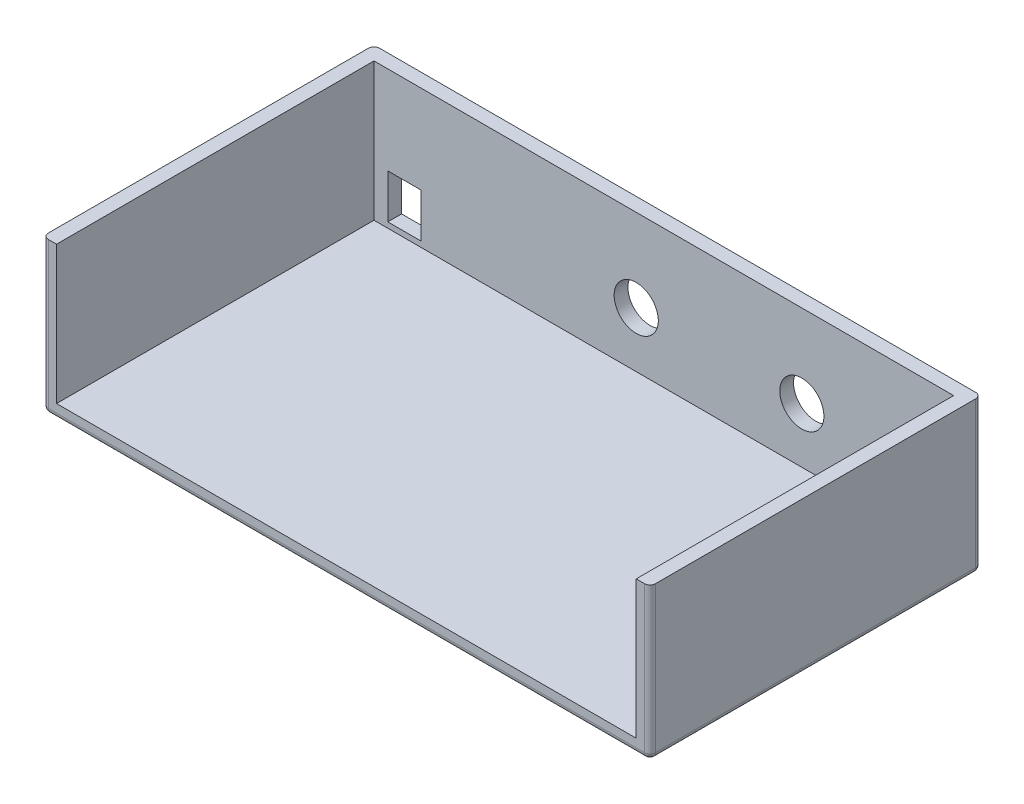
ISO-10303-21;
HEADER;
FILE_DESCRIPTION(('STEP AP214'),'2;1');
FILE_NAME('part.step','',(''),(''),'','','');
FILE_SCHEMA(('AUTOMOTIVE_DESIGN { 1 0 10303 214 1 1 1 1 }'));
ENDSEC;
DATA;
#1=APPLICATION_CONTEXT('core data for automotive mechanical design processes');
#2=APPLICATION_PROTOCOL_DEFINITION('international standard','automotive_design',2000,#1);
#3=PRODUCT_CONTEXT('',#1,'mechanical');
#4=PRODUCT('Part','Part','',(#3));
#5=PRODUCT_RELATED_PRODUCT_CATEGORY('part','',(#4));
#6=PRODUCT_DEFINITION_FORMATION('','',#4);
#7=PRODUCT_DEFINITION_CONTEXT('part definition',#1,'design');
#8=PRODUCT_DEFINITION('design','',#6,#7);
#9=PRODUCT_DEFINITION_SHAPE('','',#8);
#10=(LENGTH_UNIT() NAMED_UNIT(*) SI_UNIT(.MILLI.,.METRE.));
#11=(NAMED_UNIT(*) PLANE_ANGLE_UNIT() SI_UNIT($,.RADIAN.));
#12=(NAMED_UNIT(*) SI_UNIT($,.STERADIAN.) SOLID_ANGLE_UNIT());
#13=UNCERTAINTY_MEASURE_WITH_UNIT(LENGTH_MEASURE(1.E-05),#10,'distance_accuracy_value','');
#14=(GEOMETRIC_REPRESENTATION_CONTEXT(3) GLOBAL_UNCERTAINTY_ASSIGNED_CONTEXT((#13)) GLOBAL_UNIT_ASSIGNED_CONTEXT((#10,
#11,#12)) REPRESENTATION_CONTEXT('',''));
#15=CARTESIAN_POINT('',(0.,0.,0.));
#16=DIRECTION('',(0.,0.,1.));
#17=DIRECTION('',(1.,0.,0.));
#18=AXIS2_PLACEMENT_3D('',#15,#16,#17);
#19=CARTESIAN_POINT('',(-110.,5.,-60.));
#20=DIRECTION('',(0.,0.,-1.));
#21=DIRECTION('',(-1.,0.,0.));
#22=AXIS2_PLACEMENT_3D('',#19,#20,#21);
#23=PLANE('',#22);
#24=DIRECTION('',(0.,-1.,0.));
#25=VECTOR('',#24,1.);
#26=CARTESIAN_POINT('',(-88.,23.,-60.));
#27=LINE('',#26,#25);
#28=CARTESIAN_POINT('',(-88.,23.,-60.));
#29=VERTEX_POINT('',#28);
#30=CARTESIAN_POINT('',(-88.,7.00000000000003,-60.));
#31=VERTEX_POINT('',#30);
#32=EDGE_CURVE('E169',#29,#31,#27,.T.);
#33=ORIENTED_EDGE('',*,*,#32,.F.);
#34=DIRECTION('',(1.,0.,0.));
#35=VECTOR('',#34,1.);
#36=CARTESIAN_POINT('',(-88.,23.,-60.));
#37=LINE('',#36,#35);
#38=CARTESIAN_POINT('',(-100.,23.,-60.));
#39=VERTEX_POINT('',#38);
#40=EDGE_CURVE('E174',#39,#29,#37,.T.);
#41=ORIENTED_EDGE('',*,*,#40,.F.);
#42=DIRECTION('',(0.,1.,0.));
#43=VECTOR('',#42,1.);
#44=CARTESIAN_POINT('',(-100.,23.,-60.));
#45=LINE('',#44,#43);
#46=CARTESIAN_POINT('',(-100.,7.00000000000002,-60.));
#47=VERTEX_POINT('',#46);
#48=EDGE_CURVE('E197',#47,#39,#45,.T.);
#49=ORIENTED_EDGE('',*,*,#48,.F.);
#50=DIRECTION('',(-1.,0.,0.));
#51=VECTOR('',#50,1.);
#52=CARTESIAN_POINT('',(-88.,7.00000000000003,-60.));
#53=LINE('',#52,#51);
#54=EDGE_CURVE('E190',#31,#47,#53,.T.);
#55=ORIENTED_EDGE('',*,*,#54,.F.);
#56=EDGE_LOOP('',(#33,#41,#49,#55));
#57=FACE_BOUND('',#56,.T.);
#58=CARTESIAN_POINT('',(50.,25.,-60.));
#59=DIRECTION('',(0.,0.,-1.));
#60=DIRECTION('',(-1.,0.,0.));
#61=AXIS2_PLACEMENT_3D('',#58,#59,#60);
#62=CIRCLE('',#61,8.);
#63=CARTESIAN_POINT('',(42.,25.,-60.));
#64=VERTEX_POINT('',#63);
#65=EDGE_CURVE('E206',#64,#64,#62,.T.);
#66=ORIENTED_EDGE('',*,*,#65,.F.);
#67=EDGE_LOOP('',(#66));
#68=FACE_BOUND('',#67,.T.);
#69=CARTESIAN_POINT('',(-10.,25.,-60.));
#70=DIRECTION('',(0.,0.,-1.));
#71=DIRECTION('',(-1.,0.,0.));
#72=AXIS2_PLACEMENT_3D('',#69,#70,#71);
#73=CIRCLE('',#72,8.);
#74=CARTESIAN_POINT('',(-18.,25.,-60.));
#75=VERTEX_POINT('',#74);
#76=EDGE_CURVE('E213',#75,#75,#73,.T.);
#77=ORIENTED_EDGE('',*,*,#76,.F.);
#78=EDGE_LOOP('',(#77));
#79=FACE_BOUND('',#78,.T.);
#80=CARTESIAN_POINT('',(90.,25.,-60.));
#81=DIRECTION('',(0.,0.,-1.));
#82=DIRECTION('',(-1.,0.,0.));
#83=AXIS2_PLACEMENT_3D('',#80,#81,#82);
#84=CIRCLE('',#83,3.50000000000001);
#85=CARTESIAN_POINT('',(86.5,25.,-60.));
#86=VERTEX_POINT('',#85);
#87=EDGE_CURVE('E219',#86,#86,#84,.T.);
#88=ORIENTED_EDGE('',*,*,#87,.F.);
#89=EDGE_LOOP('',(#88));
#90=FACE_BOUND('',#89,.T.);
#91=DIRECTION('',(1.,0.,0.));
#92=VECTOR('',#91,1.);
#93=CARTESIAN_POINT('',(-110.,2.,-60.));
#94=LINE('',#93,#92);
#95=CARTESIAN_POINT('',(108.,2.,-60.));
#96=VERTEX_POINT('',#95);
#97=CARTESIAN_POINT('',(-108.,2.,-60.));
#98=VERTEX_POINT('',#97);
#99=EDGE_CURVE('E290',#96,#98,#94,.F.);
#100=ORIENTED_EDGE('',*,*,#99,.T.);
#101=DIRECTION('',(0.,-1.,0.));
#102=VECTOR('',#101,1.);
#103=CARTESIAN_POINT('',(-108.,5.,-60.));
#104=LINE('',#103,#102);
#105=CARTESIAN_POINT('',(-108.,55.,-60.));
#106=VERTEX_POINT('',#105);
#107=EDGE_CURVE('E292',#98,#106,#104,.F.);
#108=ORIENTED_EDGE('',*,*,#107,.T.);
#109=DIRECTION('',(-1.,0.,0.));
#110=VECTOR('',#109,1.);
#111=CARTESIAN_POINT('',(110.,55.,-60.));
#112=LINE('',#111,#110);
#113=CARTESIAN_POINT('',(108.,55.,-60.));
#114=VERTEX_POINT('',#113);
#115=EDGE_CURVE('E242',#114,#106,#112,.T.);
#116=ORIENTED_EDGE('',*,*,#115,.F.);
#117=DIRECTION('',(0.,-1.,0.));
#118=VECTOR('',#117,1.);
#119=CARTESIAN_POINT('',(108.,0.,-60.));
#120=LINE('',#119,#118);
#121=EDGE_CURVE('E288',#114,#96,#120,.T.);
#122=ORIENTED_EDGE('',*,*,#121,.T.);
#123=EDGE_LOOP('',(#100,#108,#116,#122));
#124=FACE_BOUND('',#123,.T.);
#125=ADVANCED_FACE('F36',(#57,#68,#79,#90,#124),#23,.T.);
#126=CARTESIAN_POINT('',(-110.,5.,60.));
#127=DIRECTION('',(-1.,0.,0.));
#128=DIRECTION('',(0.,0.,1.));
#129=AXIS2_PLACEMENT_3D('',#126,#127,#128);
#130=PLANE('',#129);
#131=DIRECTION('',(0.,0.,1.));
#132=VECTOR('',#131,1.);
#133=CARTESIAN_POINT('',(-110.,55.,-60.));
#134=LINE('',#133,#132);
#135=CARTESIAN_POINT('',(-110.,55.,-58.));
#136=VERTEX_POINT('',#135);
#137=CARTESIAN_POINT('',(-110.,55.,58.));
#138=VERTEX_POINT('',#137);
#139=EDGE_CURVE('E224',#136,#138,#134,.T.);
#140=ORIENTED_EDGE('',*,*,#139,.F.);
#141=DIRECTION('',(0.,-1.,0.));
#142=VECTOR('',#141,1.);
#143=CARTESIAN_POINT('',(-110.,5.,-58.));
#144=LINE('',#143,#142);
#145=CARTESIAN_POINT('',(-110.,2.,-58.));
#146=VERTEX_POINT('',#145);
#147=EDGE_CURVE('E53',#136,#146,#144,.T.);
#148=ORIENTED_EDGE('',*,*,#147,.T.);
#149=DIRECTION('',(0.,0.,-1.));
#150=VECTOR('',#149,1.);
#151=CARTESIAN_POINT('',(-110.,2.,60.));
#152=LINE('',#151,#150);
#153=CARTESIAN_POINT('',(-110.,2.,58.));
#154=VERTEX_POINT('',#153);
#155=EDGE_CURVE('E58',#146,#154,#152,.F.);
#156=ORIENTED_EDGE('',*,*,#155,.T.);
#157=DIRECTION('',(0.,-1.,0.));
#158=VECTOR('',#157,1.);
#159=CARTESIAN_POINT('',(-110.,55.,58.));
#160=LINE('',#159,#158);
#161=EDGE_CURVE('E294',#154,#138,#160,.F.);
#162=ORIENTED_EDGE('',*,*,#161,.T.);
#163=EDGE_LOOP('',(#140,#148,#156,#162));
#164=FACE_BOUND('',#163,.T.);
#165=ADVANCED_FACE('F353',(#164),#130,.T.);
#166=CARTESIAN_POINT('',(-110.,5.,60.));
#167=DIRECTION('',(0.,0.,-1.));
#168=DIRECTION('',(-1.,0.,0.));
#169=AXIS2_PLACEMENT_3D('',#166,#167,#168);
#170=PLANE('',#169);
#171=DIRECTION('',(1.,0.,0.));
#172=VECTOR('',#171,1.);
#173=CARTESIAN_POINT('',(-110.,55.,60.));
#174=LINE('',#173,#172);
#175=CARTESIAN_POINT('',(-108.,55.,60.));
#176=VERTEX_POINT('',#175);
#177=CARTESIAN_POINT('',(-105.,55.,60.));
#178=VERTEX_POINT('',#177);
#179=EDGE_CURVE('E227',#176,#178,#174,.T.);
#180=ORIENTED_EDGE('',*,*,#179,.F.);
#181=DIRECTION('',(0.,-1.,0.));
#182=VECTOR('',#181,1.);
#183=CARTESIAN_POINT('',(-108.,0.,60.));
#184=LINE('',#183,#182);
#185=CARTESIAN_POINT('',(-108.,2.,60.));
#186=VERTEX_POINT('',#185);
#187=EDGE_CURVE('E271',#176,#186,#184,.T.);
#188=ORIENTED_EDGE('',*,*,#187,.T.);
#189=DIRECTION('',(1.,0.,0.));
#190=VECTOR('',#189,1.);
#191=CARTESIAN_POINT('',(-110.,2.,60.));
#192=LINE('',#191,#190);
#193=CARTESIAN_POINT('',(108.,2.,60.));
#194=VERTEX_POINT('',#193);
#195=EDGE_CURVE('E268',#186,#194,#192,.T.);
#196=ORIENTED_EDGE('',*,*,#195,.T.);
#197=DIRECTION('',(0.,-1.,0.));
#198=VECTOR('',#197,1.);
#199=CARTESIAN_POINT('',(108.,5.,60.));
#200=LINE('',#199,#198);
#201=CARTESIAN_POINT('',(108.,55.,60.));
#202=VERTEX_POINT('',#201);
#203=EDGE_CURVE('E266',#194,#202,#200,.F.);
#204=ORIENTED_EDGE('',*,*,#203,.T.);
#205=DIRECTION('',(1.,0.,0.));
#206=VECTOR('',#205,1.);
#207=CARTESIAN_POINT('',(110.,55.,60.));
#208=LINE('',#207,#206);
#209=CARTESIAN_POINT('',(105.,55.,60.));
#210=VERTEX_POINT('',#209);
#211=EDGE_CURVE('E236',#210,#202,#208,.T.);
#212=ORIENTED_EDGE('',*,*,#211,.F.);
#213=DIRECTION('',(0.,-1.,0.));
#214=VECTOR('',#213,1.);
#215=CARTESIAN_POINT('',(105.,55.,60.));
#216=LINE('',#215,#214);
#217=CARTESIAN_POINT('',(105.,5.,60.));
#218=VERTEX_POINT('',#217);
#219=EDGE_CURVE('E245',#210,#218,#216,.T.);
#220=ORIENTED_EDGE('',*,*,#219,.T.);
#221=DIRECTION('',(1.,0.,0.));
#222=VECTOR('',#221,1.);
#223=CARTESIAN_POINT('',(-110.,5.,60.));
#224=LINE('',#223,#222);
#225=CARTESIAN_POINT('',(-105.,5.,60.));
#226=VERTEX_POINT('',#225);
#227=EDGE_CURVE('E264',#226,#218,#224,.T.);
#228=ORIENTED_EDGE('',*,*,#227,.F.);
#229=DIRECTION('',(0.,-1.,0.));
#230=VECTOR('',#229,1.);
#231=CARTESIAN_POINT('',(-105.,55.,60.));
#232=LINE('',#231,#230);
#233=EDGE_CURVE('E261',#178,#226,#232,.T.);
#234=ORIENTED_EDGE('',*,*,#233,.F.);
#235=EDGE_LOOP('',(#180,#188,#196,#204,#212,#220,#228,#234));
#236=FACE_BOUND('',#235,.T.);
#237=ADVANCED_FACE('F394',(#236),#170,.F.);
#238=CARTESIAN_POINT('',(110.,5.,60.));
#239=DIRECTION('',(-1.,0.,0.));
#240=DIRECTION('',(0.,0.,1.));
#241=AXIS2_PLACEMENT_3D('',#238,#239,#240);
#242=PLANE('',#241);
#243=DIRECTION('',(0.,0.,-1.));
#244=VECTOR('',#243,1.);
#245=CARTESIAN_POINT('',(110.,2.,60.));
#246=LINE('',#245,#244);
#247=CARTESIAN_POINT('',(110.,2.,58.));
#248=VERTEX_POINT('',#247);
#249=CARTESIAN_POINT('',(110.,2.,-58.));
#250=VERTEX_POINT('',#249);
#251=EDGE_CURVE('E284',#248,#250,#246,.T.);
#252=ORIENTED_EDGE('',*,*,#251,.T.);
#253=DIRECTION('',(0.,-1.,0.));
#254=VECTOR('',#253,1.);
#255=CARTESIAN_POINT('',(110.,55.,-58.));
#256=LINE('',#255,#254);
#257=CARTESIAN_POINT('',(110.,55.,-58.));
#258=VERTEX_POINT('',#257);
#259=EDGE_CURVE('E286',#250,#258,#256,.F.);
#260=ORIENTED_EDGE('',*,*,#259,.T.);
#261=DIRECTION('',(0.,0.,-1.));
#262=VECTOR('',#261,1.);
#263=CARTESIAN_POINT('',(110.,55.,-60.));
#264=LINE('',#263,#262);
#265=CARTESIAN_POINT('',(110.,55.,58.));
#266=VERTEX_POINT('',#265);
#267=EDGE_CURVE('E239',#266,#258,#264,.T.);
#268=ORIENTED_EDGE('',*,*,#267,.F.);
#269=DIRECTION('',(0.,-1.,0.));
#270=VECTOR('',#269,1.);
#271=CARTESIAN_POINT('',(110.,5.,58.));
#272=LINE('',#271,#270);
#273=EDGE_CURVE('E282',#266,#248,#272,.T.);
#274=ORIENTED_EDGE('',*,*,#273,.T.);
#275=EDGE_LOOP('',(#252,#260,#268,#274));
#276=FACE_BOUND('',#275,.T.);
#277=ADVANCED_FACE('F412',(#276),#242,.F.);
#278=CARTESIAN_POINT('',(0.,5.,0.));
#279=DIRECTION('',(0.,1.,0.));
#280=DIRECTION('',(0.,0.,1.));
#281=AXIS2_PLACEMENT_3D('',#278,#279,#280);
#282=PLANE('',#281);
#283=DIRECTION('',(0.,0.,1.));
#284=VECTOR('',#283,1.);
#285=CARTESIAN_POINT('',(105.,5.,-55.));
#286=LINE('',#285,#284);
#287=CARTESIAN_POINT('',(105.,5.,-55.));
#288=VERTEX_POINT('',#287);
#289=EDGE_CURVE('E228',#288,#218,#286,.T.);
#290=ORIENTED_EDGE('',*,*,#289,.F.);
#291=DIRECTION('',(1.,0.,0.));
#292=VECTOR('',#291,1.);
#293=CARTESIAN_POINT('',(105.,5.,-55.));
#294=LINE('',#293,#292);
#295=CARTESIAN_POINT('',(-105.,5.,-55.));
#296=VERTEX_POINT('',#295);
#297=EDGE_CURVE('E248',#296,#288,#294,.T.);
#298=ORIENTED_EDGE('',*,*,#297,.F.);
#299=DIRECTION('',(0.,0.,-1.));
#300=VECTOR('',#299,1.);
#301=CARTESIAN_POINT('',(-105.,5.,-55.));
#302=LINE('',#301,#300);
#303=EDGE_CURVE('E182',#226,#296,#302,.T.);
#304=ORIENTED_EDGE('',*,*,#303,.F.);
#305=ORIENTED_EDGE('',*,*,#227,.T.);
#306=EDGE_LOOP('',(#290,#298,#304,#305));
#307=FACE_BOUND('',#306,.T.);
#308=ADVANCED_FACE('F410',(#307),#282,.T.);
#309=CARTESIAN_POINT('',(0.,0.,0.));
#310=DIRECTION('',(0.,1.,0.));
#311=DIRECTION('',(0.,0.,1.));
#312=AXIS2_PLACEMENT_3D('',#309,#310,#311);
#313=PLANE('',#312);
#314=DIRECTION('',(0.,0.,-1.));
#315=VECTOR('',#314,1.);
#316=CARTESIAN_POINT('',(108.,0.,0.));
#317=LINE('',#316,#315);
#318=CARTESIAN_POINT('',(108.,0.,-58.));
#319=VERTEX_POINT('',#318);
#320=CARTESIAN_POINT('',(108.,0.,58.));
#321=VERTEX_POINT('',#320);
#322=EDGE_CURVE('E277',#319,#321,#317,.F.);
#323=ORIENTED_EDGE('',*,*,#322,.T.);
#324=DIRECTION('',(1.,0.,0.));
#325=VECTOR('',#324,1.);
#326=CARTESIAN_POINT('',(0.,0.,58.));
#327=LINE('',#326,#325);
#328=CARTESIAN_POINT('',(-108.,0.,58.));
#329=VERTEX_POINT('',#328);
#330=EDGE_CURVE('E279',#321,#329,#327,.F.);
#331=ORIENTED_EDGE('',*,*,#330,.T.);
#332=DIRECTION('',(0.,0.,-1.));
#333=VECTOR('',#332,1.);
#334=CARTESIAN_POINT('',(-108.,0.,-60.));
#335=LINE('',#334,#333);
#336=CARTESIAN_POINT('',(-108.,0.,-58.));
#337=VERTEX_POINT('',#336);
#338=EDGE_CURVE('E273',#329,#337,#335,.T.);
#339=ORIENTED_EDGE('',*,*,#338,.T.);
#340=DIRECTION('',(1.,0.,0.));
#341=VECTOR('',#340,1.);
#342=CARTESIAN_POINT('',(110.,0.,-58.));
#343=LINE('',#342,#341);
#344=EDGE_CURVE('E275',#337,#319,#343,.T.);
#345=ORIENTED_EDGE('',*,*,#344,.T.);
#346=EDGE_LOOP('',(#323,#331,#339,#345));
#347=FACE_BOUND('',#346,.T.);
#348=ADVANCED_FACE('F380',(#347),#313,.F.);
#349=CARTESIAN_POINT('',(-105.,55.,-55.));
#350=DIRECTION('',(-1.,0.,0.));
#351=DIRECTION('',(0.,0.,1.));
#352=AXIS2_PLACEMENT_3D('',#349,#350,#351);
#353=PLANE('',#352);
#354=ORIENTED_EDGE('',*,*,#303,.T.);
#355=DIRECTION('',(0.,-1.,0.));
#356=VECTOR('',#355,1.);
#357=CARTESIAN_POINT('',(-105.,55.,-55.));
#358=LINE('',#357,#356);
#359=CARTESIAN_POINT('',(-105.,55.,-55.));
#360=VERTEX_POINT('',#359);
#361=EDGE_CURVE('E258',#360,#296,#358,.T.);
#362=ORIENTED_EDGE('',*,*,#361,.F.);
#363=DIRECTION('',(0.,0.,-1.));
#364=VECTOR('',#363,1.);
#365=CARTESIAN_POINT('',(-105.,55.,-55.));
#366=LINE('',#365,#364);
#367=EDGE_CURVE('E230',#178,#360,#366,.T.);
#368=ORIENTED_EDGE('',*,*,#367,.F.);
#369=ORIENTED_EDGE('',*,*,#233,.T.);
#370=EDGE_LOOP('',(#354,#362,#368,#369));
#371=FACE_BOUND('',#370,.T.);
#372=ADVANCED_FACE('F402',(#371),#353,.F.);
#373=CARTESIAN_POINT('',(105.,55.,-55.));
#374=DIRECTION('',(0.,0.,-1.));
#375=DIRECTION('',(-1.,0.,0.));
#376=AXIS2_PLACEMENT_3D('',#373,#374,#375);
#377=PLANE('',#376);
#378=DIRECTION('',(-1.,0.,0.));
#379=VECTOR('',#378,1.);
#380=CARTESIAN_POINT('',(-88.,23.,-55.));
#381=LINE('',#380,#379);
#382=CARTESIAN_POINT('',(-88.,23.,-55.));
#383=VERTEX_POINT('',#382);
#384=CARTESIAN_POINT('',(-100.,23.,-55.));
#385=VERTEX_POINT('',#384);
#386=EDGE_CURVE('E188',#383,#385,#381,.T.);
#387=ORIENTED_EDGE('',*,*,#386,.F.);
#388=DIRECTION('',(0.,1.,0.));
#389=VECTOR('',#388,1.);
#390=CARTESIAN_POINT('',(-88.,23.,-55.));
#391=LINE('',#390,#389);
#392=CARTESIAN_POINT('',(-88.,7.00000000000003,-55.));
#393=VERTEX_POINT('',#392);
#394=EDGE_CURVE('E166',#393,#383,#391,.T.);
#395=ORIENTED_EDGE('',*,*,#394,.F.);
#396=DIRECTION('',(1.,0.,0.));
#397=VECTOR('',#396,1.);
#398=CARTESIAN_POINT('',(-88.,7.00000000000003,-55.));
#399=LINE('',#398,#397);
#400=CARTESIAN_POINT('',(-100.,7.00000000000002,-55.));
#401=VERTEX_POINT('',#400);
#402=EDGE_CURVE('E178',#401,#393,#399,.T.);
#403=ORIENTED_EDGE('',*,*,#402,.F.);
#404=DIRECTION('',(0.,-1.,0.));
#405=VECTOR('',#404,1.);
#406=CARTESIAN_POINT('',(-100.,23.,-55.));
#407=LINE('',#406,#405);
#408=EDGE_CURVE('E192',#385,#401,#407,.T.);
#409=ORIENTED_EDGE('',*,*,#408,.F.);
#410=EDGE_LOOP('',(#387,#395,#403,#409));
#411=FACE_BOUND('',#410,.T.);
#412=CARTESIAN_POINT('',(50.,25.,-55.));
#413=DIRECTION('',(0.,0.,-1.));
#414=DIRECTION('',(-1.,0.,0.));
#415=AXIS2_PLACEMENT_3D('',#412,#413,#414);
#416=CIRCLE('',#415,8.);
#417=CARTESIAN_POINT('',(42.,25.,-55.));
#418=VERTEX_POINT('',#417);
#419=EDGE_CURVE('E209',#418,#418,#416,.F.);
#420=ORIENTED_EDGE('',*,*,#419,.F.);
#421=EDGE_LOOP('',(#420));
#422=FACE_BOUND('',#421,.T.);
#423=CARTESIAN_POINT('',(-10.,25.,-55.));
#424=DIRECTION('',(0.,0.,-1.));
#425=DIRECTION('',(-1.,0.,0.));
#426=AXIS2_PLACEMENT_3D('',#423,#424,#425);
#427=CIRCLE('',#426,8.);
#428=CARTESIAN_POINT('',(-18.,25.,-55.));
#429=VERTEX_POINT('',#428);
#430=EDGE_CURVE('E210',#429,#429,#427,.F.);
#431=ORIENTED_EDGE('',*,*,#430,.F.);
#432=EDGE_LOOP('',(#431));
#433=FACE_BOUND('',#432,.T.);
#434=CARTESIAN_POINT('',(90.,25.,-55.));
#435=DIRECTION('',(0.,0.,-1.));
#436=DIRECTION('',(-1.,0.,0.));
#437=AXIS2_PLACEMENT_3D('',#434,#435,#436);
#438=CIRCLE('',#437,3.50000000000001);
#439=CARTESIAN_POINT('',(86.5,25.,-55.));
#440=VERTEX_POINT('',#439);
#441=EDGE_CURVE('E216',#440,#440,#438,.F.);
#442=ORIENTED_EDGE('',*,*,#441,.F.);
#443=EDGE_LOOP('',(#442));
#444=FACE_BOUND('',#443,.T.);
#445=ORIENTED_EDGE('',*,*,#297,.T.);
#446=DIRECTION('',(0.,-1.,0.));
#447=VECTOR('',#446,1.);
#448=CARTESIAN_POINT('',(105.,55.,-55.));
#449=LINE('',#448,#447);
#450=CARTESIAN_POINT('',(105.,55.,-55.));
#451=VERTEX_POINT('',#450);
#452=EDGE_CURVE('E255',#451,#288,#449,.T.);
#453=ORIENTED_EDGE('',*,*,#452,.F.);
#454=DIRECTION('',(1.,0.,0.));
#455=VECTOR('',#454,1.);
#456=CARTESIAN_POINT('',(105.,55.,-55.));
#457=LINE('',#456,#455);
#458=EDGE_CURVE('E232',#360,#451,#457,.T.);
#459=ORIENTED_EDGE('',*,*,#458,.F.);
#460=ORIENTED_EDGE('',*,*,#361,.T.);
#461=EDGE_LOOP('',(#445,#453,#459,#460));
#462=FACE_BOUND('',#461,.T.);
#463=ADVANCED_FACE('F185',(#411,#422,#433,#444,#462),#377,.F.);
#464=CARTESIAN_POINT('',(105.,55.,-55.));
#465=DIRECTION('',(1.,0.,0.));
#466=DIRECTION('',(0.,0.,-1.));
#467=AXIS2_PLACEMENT_3D('',#464,#465,#466);
#468=PLANE('',#467);
#469=ORIENTED_EDGE('',*,*,#289,.T.);
#470=ORIENTED_EDGE('',*,*,#219,.F.);
#471=DIRECTION('',(0.,0.,1.));
#472=VECTOR('',#471,1.);
#473=CARTESIAN_POINT('',(105.,55.,-55.));
#474=LINE('',#473,#472);
#475=EDGE_CURVE('E234',#451,#210,#474,.T.);
#476=ORIENTED_EDGE('',*,*,#475,.F.);
#477=ORIENTED_EDGE('',*,*,#452,.T.);
#478=EDGE_LOOP('',(#469,#470,#476,#477));
#479=FACE_BOUND('',#478,.T.);
#480=ADVANCED_FACE('F407',(#479),#468,.F.);
#481=CARTESIAN_POINT('',(0.,55.,0.));
#482=DIRECTION('',(0.,1.,0.));
#483=DIRECTION('',(0.,0.,1.));
#484=AXIS2_PLACEMENT_3D('',#481,#482,#483);
#485=PLANE('',#484);
#486=ORIENTED_EDGE('',*,*,#115,.T.);
#487=CARTESIAN_POINT('',(-108.,55.,-58.));
#488=DIRECTION('',(0.,1.,0.));
#489=DIRECTION('',(0.,0.,1.));
#490=AXIS2_PLACEMENT_3D('',#487,#488,#489);
#491=CIRCLE('',#490,2.);
#492=EDGE_CURVE('E11',#106,#136,#491,.T.);
#493=ORIENTED_EDGE('',*,*,#492,.T.);
#494=ORIENTED_EDGE('',*,*,#139,.T.);
#495=CARTESIAN_POINT('',(-108.,55.,58.));
#496=DIRECTION('',(0.,1.,0.));
#497=DIRECTION('',(0.,0.,1.));
#498=AXIS2_PLACEMENT_3D('',#495,#496,#497);
#499=CIRCLE('',#498,2.);
#500=EDGE_CURVE('E45',#138,#176,#499,.T.);
#501=ORIENTED_EDGE('',*,*,#500,.T.);
#502=ORIENTED_EDGE('',*,*,#179,.T.);
#503=ORIENTED_EDGE('',*,*,#367,.T.);
#504=ORIENTED_EDGE('',*,*,#458,.T.);
#505=ORIENTED_EDGE('',*,*,#475,.T.);
#506=ORIENTED_EDGE('',*,*,#211,.T.);
#507=CARTESIAN_POINT('',(108.,55.,58.));
#508=DIRECTION('',(0.,1.,0.));
#509=DIRECTION('',(0.,0.,1.));
#510=AXIS2_PLACEMENT_3D('',#507,#508,#509);
#511=CIRCLE('',#510,2.);
#512=EDGE_CURVE('E298',#202,#266,#511,.T.);
#513=ORIENTED_EDGE('',*,*,#512,.T.);
#514=ORIENTED_EDGE('',*,*,#267,.T.);
#515=CARTESIAN_POINT('',(108.,55.,-58.));
#516=DIRECTION('',(0.,1.,0.));
#517=DIRECTION('',(0.,0.,1.));
#518=AXIS2_PLACEMENT_3D('',#515,#516,#517);
#519=CIRCLE('',#518,2.);
#520=EDGE_CURVE('E300',#258,#114,#519,.T.);
#521=ORIENTED_EDGE('',*,*,#520,.T.);
#522=EDGE_LOOP('',(#486,#493,#494,#501,#502,#503,#504,#505,#506,#513,#514,#521));
#523=FACE_BOUND('',#522,.T.);
#524=ADVANCED_FACE('F355',(#523),#485,.T.);
#525=CARTESIAN_POINT('',(90.,25.,60.001));
#526=DIRECTION('',(0.,0.,-1.));
#527=DIRECTION('',(-1.,0.,0.));
#528=AXIS2_PLACEMENT_3D('',#525,#526,#527);
#529=CYLINDRICAL_SURFACE('',#528,3.50000000000001);
#530=ORIENTED_EDGE('',*,*,#87,.T.);
#531=EDGE_LOOP('',(#530));
#532=FACE_BOUND('',#531,.T.);
#533=ORIENTED_EDGE('',*,*,#441,.T.);
#534=EDGE_LOOP('',(#533));
#535=FACE_BOUND('',#534,.T.);
#536=ADVANCED_FACE('F477',(#532,#535),#529,.F.);
#537=CARTESIAN_POINT('',(-10.,25.,60.001));
#538=DIRECTION('',(0.,0.,-1.));
#539=DIRECTION('',(-1.,0.,0.));
#540=AXIS2_PLACEMENT_3D('',#537,#538,#539);
#541=CYLINDRICAL_SURFACE('',#540,8.);
#542=ORIENTED_EDGE('',*,*,#76,.T.);
#543=EDGE_LOOP('',(#542));
#544=FACE_BOUND('',#543,.T.);
#545=ORIENTED_EDGE('',*,*,#430,.T.);
#546=EDGE_LOOP('',(#545));
#547=FACE_BOUND('',#546,.T.);
#548=ADVANCED_FACE('F473',(#544,#547),#541,.F.);
#549=CARTESIAN_POINT('',(50.,25.,60.001));
#550=DIRECTION('',(0.,0.,-1.));
#551=DIRECTION('',(-1.,0.,0.));
#552=AXIS2_PLACEMENT_3D('',#549,#550,#551);
#553=CYLINDRICAL_SURFACE('',#552,8.);
#554=ORIENTED_EDGE('',*,*,#65,.T.);
#555=EDGE_LOOP('',(#554));
#556=FACE_BOUND('',#555,.T.);
#557=ORIENTED_EDGE('',*,*,#419,.T.);
#558=EDGE_LOOP('',(#557));
#559=FACE_BOUND('',#558,.T.);
#560=ADVANCED_FACE('F470',(#556,#559),#553,.F.);
#561=CARTESIAN_POINT('',(-88.,23.,60.001));
#562=DIRECTION('',(1.,0.,0.));
#563=DIRECTION('',(0.,0.,-1.));
#564=AXIS2_PLACEMENT_3D('',#561,#562,#563);
#565=PLANE('',#564);
#566=ORIENTED_EDGE('',*,*,#394,.T.);
#567=DIRECTION('',(0.,0.,-1.));
#568=VECTOR('',#567,1.);
#569=CARTESIAN_POINT('',(-88.,23.,60.001));
#570=LINE('',#569,#568);
#571=EDGE_CURVE('E183',#383,#29,#570,.T.);
#572=ORIENTED_EDGE('',*,*,#571,.T.);
#573=ORIENTED_EDGE('',*,*,#32,.T.);
#574=DIRECTION('',(0.,0.,-1.));
#575=VECTOR('',#574,1.);
#576=CARTESIAN_POINT('',(-88.,7.00000000000003,60.001));
#577=LINE('',#576,#575);
#578=EDGE_CURVE('E162',#393,#31,#577,.T.);
#579=ORIENTED_EDGE('',*,*,#578,.F.);
#580=EDGE_LOOP('',(#566,#572,#573,#579));
#581=FACE_BOUND('',#580,.T.);
#582=ADVANCED_FACE('F164',(#581),#565,.F.);
#583=CARTESIAN_POINT('',(-88.,23.,60.001));
#584=DIRECTION('',(0.,1.,0.));
#585=DIRECTION('',(0.,0.,1.));
#586=AXIS2_PLACEMENT_3D('',#583,#584,#585);
#587=PLANE('',#586);
#588=ORIENTED_EDGE('',*,*,#386,.T.);
#589=DIRECTION('',(0.,0.,-1.));
#590=VECTOR('',#589,1.);
#591=CARTESIAN_POINT('',(-100.,23.,60.001));
#592=LINE('',#591,#590);
#593=EDGE_CURVE('E203',#385,#39,#592,.T.);
#594=ORIENTED_EDGE('',*,*,#593,.T.);
#595=ORIENTED_EDGE('',*,*,#40,.T.);
#596=ORIENTED_EDGE('',*,*,#571,.F.);
#597=EDGE_LOOP('',(#588,#594,#595,#596));
#598=FACE_BOUND('',#597,.T.);
#599=ADVANCED_FACE('F463',(#598),#587,.F.);
#600=CARTESIAN_POINT('',(-100.,23.,60.001));
#601=DIRECTION('',(-1.,0.,0.));
#602=DIRECTION('',(0.,0.,1.));
#603=AXIS2_PLACEMENT_3D('',#600,#601,#602);
#604=PLANE('',#603);
#605=ORIENTED_EDGE('',*,*,#408,.T.);
#606=DIRECTION('',(0.,0.,-1.));
#607=VECTOR('',#606,1.);
#608=CARTESIAN_POINT('',(-100.,7.00000000000002,60.001));
#609=LINE('',#608,#607);
#610=EDGE_CURVE('E173',#401,#47,#609,.T.);
#611=ORIENTED_EDGE('',*,*,#610,.T.);
#612=ORIENTED_EDGE('',*,*,#48,.T.);
#613=ORIENTED_EDGE('',*,*,#593,.F.);
#614=EDGE_LOOP('',(#605,#611,#612,#613));
#615=FACE_BOUND('',#614,.T.);
#616=ADVANCED_FACE('F458',(#615),#604,.F.);
#617=CARTESIAN_POINT('',(-88.,7.00000000000003,60.001));
#618=DIRECTION('',(0.,-1.,0.));
#619=DIRECTION('',(1.,0.,0.));
#620=AXIS2_PLACEMENT_3D('',#617,#618,#619);
#621=PLANE('',#620);
#622=ORIENTED_EDGE('',*,*,#402,.T.);
#623=ORIENTED_EDGE('',*,*,#578,.T.);
#624=ORIENTED_EDGE('',*,*,#54,.T.);
#625=ORIENTED_EDGE('',*,*,#610,.F.);
#626=EDGE_LOOP('',(#622,#623,#624,#625));
#627=FACE_BOUND('',#626,.T.);
#628=ADVANCED_FACE('F179',(#627),#621,.F.);
#629=CARTESIAN_POINT('',(-108.,5.,-58.));
#630=DIRECTION('',(0.,-1.,0.));
#631=DIRECTION('',(0.,0.,-1.));
#632=AXIS2_PLACEMENT_3D('',#629,#630,#631);
#633=CYLINDRICAL_SURFACE('',#632,2.);
#634=ORIENTED_EDGE('',*,*,#492,.F.);
#635=ORIENTED_EDGE('',*,*,#107,.F.);
#636=CARTESIAN_POINT('',(-108.,2.,-58.));
#637=DIRECTION('',(0.,-1.,0.));
#638=DIRECTION('',(0.,0.,-1.));
#639=AXIS2_PLACEMENT_3D('',#636,#637,#638);
#640=CIRCLE('',#639,2.);
#641=EDGE_CURVE('E330',#146,#98,#640,.T.);
#642=ORIENTED_EDGE('',*,*,#641,.F.);
#643=ORIENTED_EDGE('',*,*,#147,.F.);
#644=EDGE_LOOP('',(#634,#635,#642,#643));
#645=FACE_BOUND('',#644,.T.);
#646=ADVANCED_FACE('F38',(#645),#633,.T.);
#647=CARTESIAN_POINT('',(108.,5.,-58.));
#648=DIRECTION('',(0.,1.,0.));
#649=DIRECTION('',(0.,0.,1.));
#650=AXIS2_PLACEMENT_3D('',#647,#648,#649);
#651=CYLINDRICAL_SURFACE('',#650,2.);
#652=ORIENTED_EDGE('',*,*,#520,.F.);
#653=ORIENTED_EDGE('',*,*,#259,.F.);
#654=CARTESIAN_POINT('',(108.,2.,-58.));
#655=DIRECTION('',(0.,-1.,0.));
#656=DIRECTION('',(0.,0.,-1.));
#657=AXIS2_PLACEMENT_3D('',#654,#655,#656);
#658=CIRCLE('',#657,2.);
#659=EDGE_CURVE('E328',#96,#250,#658,.T.);
#660=ORIENTED_EDGE('',*,*,#659,.F.);
#661=ORIENTED_EDGE('',*,*,#121,.F.);
#662=EDGE_LOOP('',(#652,#653,#660,#661));
#663=FACE_BOUND('',#662,.T.);
#664=ADVANCED_FACE('F370',(#663),#651,.T.);
#665=CARTESIAN_POINT('',(0.,2.,-58.));
#666=DIRECTION('',(-1.,0.,0.));
#667=DIRECTION('',(0.,0.,1.));
#668=AXIS2_PLACEMENT_3D('',#665,#666,#667);
#669=CYLINDRICAL_SURFACE('',#668,2.);
#670=CARTESIAN_POINT('',(-108.,2.,-58.));
#671=DIRECTION('',(-1.,0.,0.));
#672=DIRECTION('',(0.,0.,1.));
#673=AXIS2_PLACEMENT_3D('',#670,#671,#672);
#674=CIRCLE('',#673,2.);
#675=EDGE_CURVE('E40',#98,#337,#674,.T.);
#676=ORIENTED_EDGE('',*,*,#675,.F.);
#677=ORIENTED_EDGE('',*,*,#99,.F.);
#678=CARTESIAN_POINT('',(108.,2.,-58.));
#679=DIRECTION('',(1.,0.,0.));
#680=DIRECTION('',(0.,0.,-1.));
#681=AXIS2_PLACEMENT_3D('',#678,#679,#680);
#682=CIRCLE('',#681,2.);
#683=EDGE_CURVE('E325',#319,#96,#682,.T.);
#684=ORIENTED_EDGE('',*,*,#683,.F.);
#685=ORIENTED_EDGE('',*,*,#344,.F.);
#686=EDGE_LOOP('',(#676,#677,#684,#685));
#687=FACE_BOUND('',#686,.T.);
#688=ADVANCED_FACE('F365',(#687),#669,.T.);
#689=CARTESIAN_POINT('',(-108.,2.,-58.));
#690=DIRECTION('',(0.,0.,1.));
#691=DIRECTION('',(1.,0.,0.));
#692=AXIS2_PLACEMENT_3D('',#689,#690,#691);
#693=SPHERICAL_SURFACE('',#692,2.);
#694=ORIENTED_EDGE('',*,*,#641,.T.);
#695=ORIENTED_EDGE('',*,*,#675,.T.);
#696=CARTESIAN_POINT('',(-108.,2.,-58.));
#697=DIRECTION('',(0.,0.,-1.));
#698=DIRECTION('',(-1.,0.,0.));
#699=AXIS2_PLACEMENT_3D('',#696,#697,#698);
#700=CIRCLE('',#699,2.);
#701=EDGE_CURVE('E322',#146,#337,#700,.F.);
#702=ORIENTED_EDGE('',*,*,#701,.F.);
#703=EDGE_LOOP('',(#694,#695,#702));
#704=FACE_BOUND('',#703,.T.);
#705=ADVANCED_FACE('F336',(#704),#693,.T.);
#706=CARTESIAN_POINT('',(108.,2.,-58.));
#707=DIRECTION('',(0.,0.,1.));
#708=DIRECTION('',(1.,0.,0.));
#709=AXIS2_PLACEMENT_3D('',#706,#707,#708);
#710=SPHERICAL_SURFACE('',#709,2.);
#711=ORIENTED_EDGE('',*,*,#683,.T.);
#712=ORIENTED_EDGE('',*,*,#659,.T.);
#713=CARTESIAN_POINT('',(108.,2.,-58.));
#714=DIRECTION('',(0.,0.,-1.));
#715=DIRECTION('',(-1.,0.,0.));
#716=AXIS2_PLACEMENT_3D('',#713,#714,#715);
#717=CIRCLE('',#716,2.);
#718=EDGE_CURVE('E319',#319,#250,#717,.F.);
#719=ORIENTED_EDGE('',*,*,#718,.F.);
#720=EDGE_LOOP('',(#711,#712,#719));
#721=FACE_BOUND('',#720,.T.);
#722=ADVANCED_FACE('F372',(#721),#710,.T.);
#723=CARTESIAN_POINT('',(-108.,2.,0.));
#724=DIRECTION('',(0.,0.,1.));
#725=DIRECTION('',(1.,0.,0.));
#726=AXIS2_PLACEMENT_3D('',#723,#724,#725);
#727=CYLINDRICAL_SURFACE('',#726,2.);
#728=ORIENTED_EDGE('',*,*,#701,.T.);
#729=ORIENTED_EDGE('',*,*,#338,.F.);
#730=CARTESIAN_POINT('',(-108.,2.,58.));
#731=DIRECTION('',(0.,0.,1.));
#732=DIRECTION('',(1.,0.,0.));
#733=AXIS2_PLACEMENT_3D('',#730,#731,#732);
#734=CIRCLE('',#733,2.);
#735=EDGE_CURVE('E316',#154,#329,#734,.T.);
#736=ORIENTED_EDGE('',*,*,#735,.F.);
#737=ORIENTED_EDGE('',*,*,#155,.F.);
#738=EDGE_LOOP('',(#728,#729,#736,#737));
#739=FACE_BOUND('',#738,.T.);
#740=ADVANCED_FACE('F342',(#739),#727,.T.);
#741=CARTESIAN_POINT('',(-108.,5.,58.));
#742=DIRECTION('',(0.,1.,0.));
#743=DIRECTION('',(0.,0.,1.));
#744=AXIS2_PLACEMENT_3D('',#741,#742,#743);
#745=CYLINDRICAL_SURFACE('',#744,2.);
#746=ORIENTED_EDGE('',*,*,#500,.F.);
#747=ORIENTED_EDGE('',*,*,#161,.F.);
#748=CARTESIAN_POINT('',(-108.,2.,58.));
#749=DIRECTION('',(0.,-1.,0.));
#750=DIRECTION('',(0.,0.,-1.));
#751=AXIS2_PLACEMENT_3D('',#748,#749,#750);
#752=CIRCLE('',#751,2.);
#753=EDGE_CURVE('E313',#186,#154,#752,.T.);
#754=ORIENTED_EDGE('',*,*,#753,.F.);
#755=ORIENTED_EDGE('',*,*,#187,.F.);
#756=EDGE_LOOP('',(#746,#747,#754,#755));
#757=FACE_BOUND('',#756,.T.);
#758=ADVANCED_FACE('F352',(#757),#745,.T.);
#759=CARTESIAN_POINT('',(108.,5.,58.));
#760=DIRECTION('',(0.,-1.,0.));
#761=DIRECTION('',(0.,0.,-1.));
#762=AXIS2_PLACEMENT_3D('',#759,#760,#761);
#763=CYLINDRICAL_SURFACE('',#762,2.);
#764=ORIENTED_EDGE('',*,*,#512,.F.);
#765=ORIENTED_EDGE('',*,*,#203,.F.);
#766=CARTESIAN_POINT('',(108.,2.,58.));
#767=DIRECTION('',(0.,-1.,0.));
#768=DIRECTION('',(0.,0.,-1.));
#769=AXIS2_PLACEMENT_3D('',#766,#767,#768);
#770=CIRCLE('',#769,2.);
#771=EDGE_CURVE('E310',#248,#194,#770,.T.);
#772=ORIENTED_EDGE('',*,*,#771,.F.);
#773=ORIENTED_EDGE('',*,*,#273,.F.);
#774=EDGE_LOOP('',(#764,#765,#772,#773));
#775=FACE_BOUND('',#774,.T.);
#776=ADVANCED_FACE('F391',(#775),#763,.T.);
#777=CARTESIAN_POINT('',(108.,2.,60.));
#778=DIRECTION('',(0.,0.,-1.));
#779=DIRECTION('',(-1.,0.,0.));
#780=AXIS2_PLACEMENT_3D('',#777,#778,#779);
#781=CYLINDRICAL_SURFACE('',#780,2.);
#782=ORIENTED_EDGE('',*,*,#718,.T.);
#783=ORIENTED_EDGE('',*,*,#251,.F.);
#784=CARTESIAN_POINT('',(108.,2.,58.));
#785=DIRECTION('',(0.,0.,1.));
#786=DIRECTION('',(1.,0.,0.));
#787=AXIS2_PLACEMENT_3D('',#784,#785,#786);
#788=CIRCLE('',#787,2.);
#789=EDGE_CURVE('E307',#321,#248,#788,.T.);
#790=ORIENTED_EDGE('',*,*,#789,.F.);
#791=ORIENTED_EDGE('',*,*,#322,.F.);
#792=EDGE_LOOP('',(#782,#783,#790,#791));
#793=FACE_BOUND('',#792,.T.);
#794=ADVANCED_FACE('F377',(#793),#781,.T.);
#795=CARTESIAN_POINT('',(-108.,2.,58.));
#796=DIRECTION('',(0.,0.,1.));
#797=DIRECTION('',(1.,0.,0.));
#798=AXIS2_PLACEMENT_3D('',#795,#796,#797);
#799=SPHERICAL_SURFACE('',#798,2.);
#800=ORIENTED_EDGE('',*,*,#753,.T.);
#801=ORIENTED_EDGE('',*,*,#735,.T.);
#802=CARTESIAN_POINT('',(-108.,2.,58.));
#803=DIRECTION('',(-1.,0.,0.));
#804=DIRECTION('',(0.,0.,1.));
#805=AXIS2_PLACEMENT_3D('',#802,#803,#804);
#806=CIRCLE('',#805,2.);
#807=EDGE_CURVE('E305',#186,#329,#806,.F.);
#808=ORIENTED_EDGE('',*,*,#807,.F.);
#809=EDGE_LOOP('',(#800,#801,#808));
#810=FACE_BOUND('',#809,.T.);
#811=ADVANCED_FACE('F347',(#810),#799,.T.);
#812=CARTESIAN_POINT('',(108.,2.,58.));
#813=DIRECTION('',(0.,0.,1.));
#814=DIRECTION('',(1.,0.,0.));
#815=AXIS2_PLACEMENT_3D('',#812,#813,#814);
#816=SPHERICAL_SURFACE('',#815,2.);
#817=ORIENTED_EDGE('',*,*,#789,.T.);
#818=ORIENTED_EDGE('',*,*,#771,.T.);
#819=CARTESIAN_POINT('',(108.,2.,58.));
#820=DIRECTION('',(1.,0.,0.));
#821=DIRECTION('',(0.,0.,-1.));
#822=AXIS2_PLACEMENT_3D('',#819,#820,#821);
#823=CIRCLE('',#822,2.);
#824=EDGE_CURVE('E303',#321,#194,#823,.F.);
#825=ORIENTED_EDGE('',*,*,#824,.F.);
#826=EDGE_LOOP('',(#817,#818,#825));
#827=FACE_BOUND('',#826,.T.);
#828=ADVANCED_FACE('F385',(#827),#816,.T.);
#829=CARTESIAN_POINT('',(-110.,2.,58.));
#830=DIRECTION('',(1.,0.,0.));
#831=DIRECTION('',(0.,0.,-1.));
#832=AXIS2_PLACEMENT_3D('',#829,#830,#831);
#833=CYLINDRICAL_SURFACE('',#832,2.);
#834=ORIENTED_EDGE('',*,*,#807,.T.);
#835=ORIENTED_EDGE('',*,*,#330,.F.);
#836=ORIENTED_EDGE('',*,*,#824,.T.);
#837=ORIENTED_EDGE('',*,*,#195,.F.);
#838=EDGE_LOOP('',(#834,#835,#836,#837));
#839=FACE_BOUND('',#838,.T.);
#840=ADVANCED_FACE('F383',(#839),#833,.T.);
#841=CLOSED_SHELL('',(#125,#165,#237,#277,#308,#348,#372,#463,#480,#524,#536,#548,#560,#582,
#599,#616,#628,#646,#664,#688,#705,#722,#740,#758,#776,#794,#811,#828,#840));
#842=MANIFOLD_SOLID_BREP('B2',#841);
#843=ADVANCED_BREP_SHAPE_REPRESENTATION('',(#18,#842),#14);
#844=SHAPE_DEFINITION_REPRESENTATION(#9,#843);
ENDSEC;
END-ISO-10303-21;
